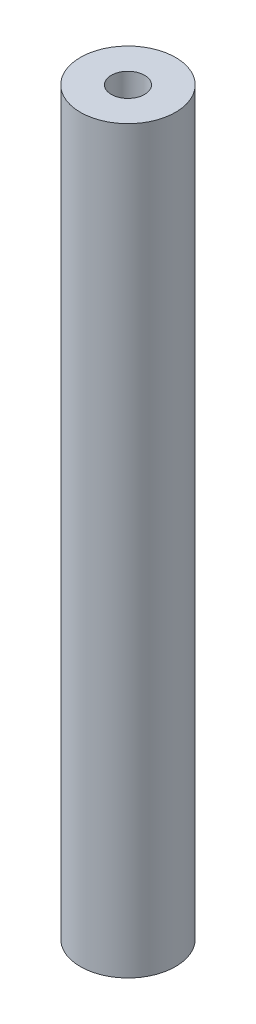
ISO-10303-21;
HEADER;
FILE_DESCRIPTION(('STEP AP214'),'2;1');
FILE_NAME('part.step','',(''),(''),'','','');
FILE_SCHEMA(('AUTOMOTIVE_DESIGN { 1 0 10303 214 1 1 1 1 }'));
ENDSEC;
DATA;
#1=APPLICATION_CONTEXT('core data for automotive mechanical design processes');
#2=APPLICATION_PROTOCOL_DEFINITION('international standard','automotive_design',2000,#1);
#3=PRODUCT_CONTEXT('',#1,'mechanical');
#4=PRODUCT('Part','Part','',(#3));
#5=PRODUCT_RELATED_PRODUCT_CATEGORY('part','',(#4));
#6=PRODUCT_DEFINITION_FORMATION('','',#4);
#7=PRODUCT_DEFINITION_CONTEXT('part definition',#1,'design');
#8=PRODUCT_DEFINITION('design','',#6,#7);
#9=PRODUCT_DEFINITION_SHAPE('','',#8);
#10=(LENGTH_UNIT() NAMED_UNIT(*) SI_UNIT(.MILLI.,.METRE.));
#11=(NAMED_UNIT(*) PLANE_ANGLE_UNIT() SI_UNIT($,.RADIAN.));
#12=(NAMED_UNIT(*) SI_UNIT($,.STERADIAN.) SOLID_ANGLE_UNIT());
#13=UNCERTAINTY_MEASURE_WITH_UNIT(LENGTH_MEASURE(1.E-05),#10,'distance_accuracy_value','');
#14=(GEOMETRIC_REPRESENTATION_CONTEXT(3) GLOBAL_UNCERTAINTY_ASSIGNED_CONTEXT((#13)) GLOBAL_UNIT_ASSIGNED_CONTEXT((#10,
#11,#12)) REPRESENTATION_CONTEXT('',''));
#15=CARTESIAN_POINT('',(0.,0.,0.));
#16=DIRECTION('',(0.,0.,1.));
#17=DIRECTION('',(1.,0.,0.));
#18=AXIS2_PLACEMENT_3D('',#15,#16,#17);
#19=CARTESIAN_POINT('',(0.,62.2,0.));
#20=DIRECTION('',(0.,1.,0.));
#21=DIRECTION('',(0.,0.,1.));
#22=AXIS2_PLACEMENT_3D('',#19,#20,#21);
#23=PLANE('',#22);
#24=CARTESIAN_POINT('',(0.,62.2,0.));
#25=DIRECTION('',(0.,1.,0.));
#26=DIRECTION('',(0.,0.,1.));
#27=AXIS2_PLACEMENT_3D('',#24,#25,#26);
#28=CIRCLE('',#27,4.);
#29=CARTESIAN_POINT('',(0.,62.2,4.));
#30=VERTEX_POINT('',#29);
#31=EDGE_CURVE('E10',#30,#30,#28,.T.);
#32=ORIENTED_EDGE('',*,*,#31,.T.);
#33=EDGE_LOOP('',(#32));
#34=FACE_BOUND('',#33,.T.);
#35=CARTESIAN_POINT('',(0.,62.2,0.));
#36=DIRECTION('',(0.,1.,0.));
#37=DIRECTION('',(0.,0.,1.));
#38=AXIS2_PLACEMENT_3D('',#35,#36,#37);
#39=CIRCLE('',#38,1.4);
#40=CARTESIAN_POINT('',(0.,62.2,1.4));
#41=VERTEX_POINT('',#40);
#42=EDGE_CURVE('E44',#41,#41,#39,.T.);
#43=ORIENTED_EDGE('',*,*,#42,.F.);
#44=EDGE_LOOP('',(#43));
#45=FACE_BOUND('',#44,.T.);
#46=ADVANCED_FACE('F33',(#34,#45),#23,.T.);
#47=CARTESIAN_POINT('',(0.,0.,0.));
#48=DIRECTION('',(0.,1.,0.));
#49=DIRECTION('',(0.,0.,1.));
#50=AXIS2_PLACEMENT_3D('',#47,#48,#49);
#51=PLANE('',#50);
#52=CARTESIAN_POINT('',(0.,0.,0.));
#53=DIRECTION('',(0.,1.,0.));
#54=DIRECTION('',(0.,0.,1.));
#55=AXIS2_PLACEMENT_3D('',#52,#53,#54);
#56=CIRCLE('',#55,4.);
#57=CARTESIAN_POINT('',(0.,0.,4.));
#58=VERTEX_POINT('',#57);
#59=EDGE_CURVE('E37',#58,#58,#56,.T.);
#60=ORIENTED_EDGE('',*,*,#59,.F.);
#61=EDGE_LOOP('',(#60));
#62=FACE_BOUND('',#61,.T.);
#63=CARTESIAN_POINT('',(0.,0.,0.));
#64=DIRECTION('',(0.,1.,0.));
#65=DIRECTION('',(0.,0.,1.));
#66=AXIS2_PLACEMENT_3D('',#63,#64,#65);
#67=CIRCLE('',#66,1.4);
#68=CARTESIAN_POINT('',(0.,0.,1.4));
#69=VERTEX_POINT('',#68);
#70=EDGE_CURVE('E46',#69,#69,#67,.T.);
#71=ORIENTED_EDGE('',*,*,#70,.T.);
#72=EDGE_LOOP('',(#71));
#73=FACE_BOUND('',#72,.T.);
#74=ADVANCED_FACE('F56',(#62,#73),#51,.F.);
#75=CARTESIAN_POINT('',(0.,62.2,0.));
#76=DIRECTION('',(0.,-1.,0.));
#77=DIRECTION('',(0.,0.,-1.));
#78=AXIS2_PLACEMENT_3D('',#75,#76,#77);
#79=CYLINDRICAL_SURFACE('',#78,4.);
#80=ORIENTED_EDGE('',*,*,#31,.F.);
#81=EDGE_LOOP('',(#80));
#82=FACE_BOUND('',#81,.T.);
#83=ORIENTED_EDGE('',*,*,#59,.T.);
#84=EDGE_LOOP('',(#83));
#85=FACE_BOUND('',#84,.T.);
#86=ADVANCED_FACE('F35',(#82,#85),#79,.T.);
#87=CARTESIAN_POINT('',(0.,62.2,0.));
#88=DIRECTION('',(0.,-1.,0.));
#89=DIRECTION('',(0.,0.,-1.));
#90=AXIS2_PLACEMENT_3D('',#87,#88,#89);
#91=CYLINDRICAL_SURFACE('',#90,1.4);
#92=ORIENTED_EDGE('',*,*,#42,.T.);
#93=EDGE_LOOP('',(#92));
#94=FACE_BOUND('',#93,.T.);
#95=ORIENTED_EDGE('',*,*,#70,.F.);
#96=EDGE_LOOP('',(#95));
#97=FACE_BOUND('',#96,.T.);
#98=ADVANCED_FACE('F52',(#94,#97),#91,.F.);
#99=CLOSED_SHELL('',(#46,#74,#86,#98));
#100=MANIFOLD_SOLID_BREP('B2',#99);
#101=ADVANCED_BREP_SHAPE_REPRESENTATION('',(#18,#100),#14);
#102=SHAPE_DEFINITION_REPRESENTATION(#9,#101);
ENDSEC;
END-ISO-10303-21;
